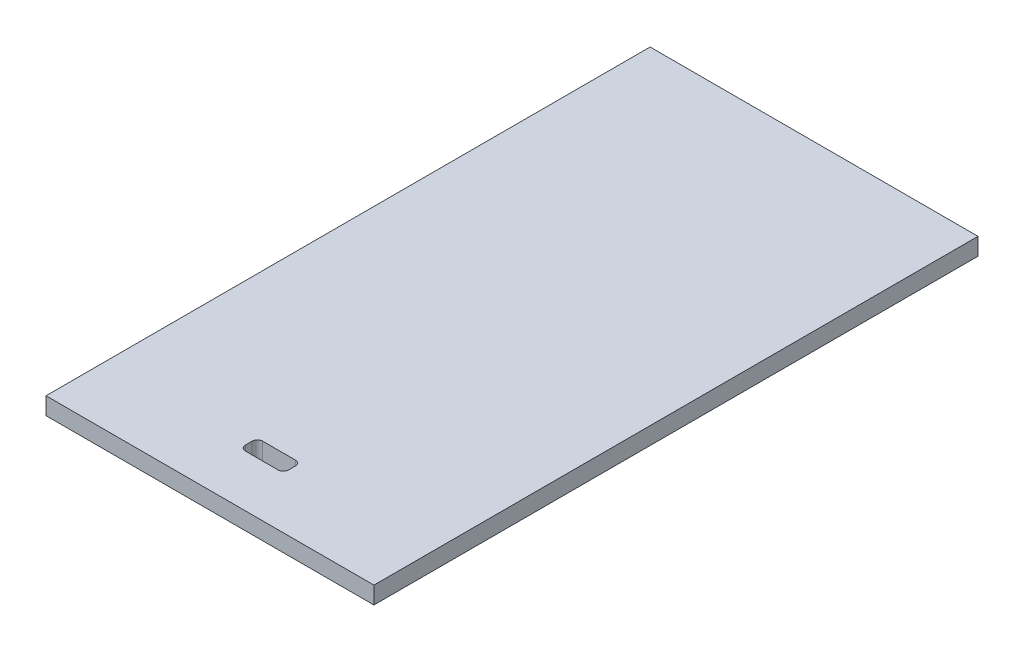
ISO-10303-21;
HEADER;
FILE_DESCRIPTION(('STEP AP214'),'2;1');
FILE_NAME('part.step','',(''),(''),'','','');
FILE_SCHEMA(('AUTOMOTIVE_DESIGN { 1 0 10303 214 1 1 1 1 }'));
ENDSEC;
DATA;
#1=APPLICATION_CONTEXT('core data for automotive mechanical design processes');
#2=APPLICATION_PROTOCOL_DEFINITION('international standard','automotive_design',2000,#1);
#3=PRODUCT_CONTEXT('',#1,'mechanical');
#4=PRODUCT('Part','Part','',(#3));
#5=PRODUCT_RELATED_PRODUCT_CATEGORY('part','',(#4));
#6=PRODUCT_DEFINITION_FORMATION('','',#4);
#7=PRODUCT_DEFINITION_CONTEXT('part definition',#1,'design');
#8=PRODUCT_DEFINITION('design','',#6,#7);
#9=PRODUCT_DEFINITION_SHAPE('','',#8);
#10=(LENGTH_UNIT() NAMED_UNIT(*) SI_UNIT(.MILLI.,.METRE.));
#11=(NAMED_UNIT(*) PLANE_ANGLE_UNIT() SI_UNIT($,.RADIAN.));
#12=(NAMED_UNIT(*) SI_UNIT($,.STERADIAN.) SOLID_ANGLE_UNIT());
#13=UNCERTAINTY_MEASURE_WITH_UNIT(LENGTH_MEASURE(1.E-05),#10,'distance_accuracy_value','');
#14=(GEOMETRIC_REPRESENTATION_CONTEXT(3) GLOBAL_UNCERTAINTY_ASSIGNED_CONTEXT((#13)) GLOBAL_UNIT_ASSIGNED_CONTEXT((#10,
#11,#12)) REPRESENTATION_CONTEXT('',''));
#15=CARTESIAN_POINT('',(0.,0.,0.));
#16=DIRECTION('',(0.,0.,1.));
#17=DIRECTION('',(1.,0.,0.));
#18=AXIS2_PLACEMENT_3D('',#15,#16,#17);
#19=CARTESIAN_POINT('',(0.,20.,0.));
#20=DIRECTION('',(1.,0.,0.));
#21=DIRECTION('',(0.,0.,-1.));
#22=AXIS2_PLACEMENT_3D('',#19,#20,#21);
#23=PLANE('',#22);
#24=DIRECTION('',(0.,0.,1.));
#25=VECTOR('',#24,1.);
#26=CARTESIAN_POINT('',(0.,0.,0.));
#27=LINE('',#26,#25);
#28=CARTESIAN_POINT('',(0.,0.,-700.));
#29=VERTEX_POINT('',#28);
#30=CARTESIAN_POINT('',(0.,0.,0.));
#31=VERTEX_POINT('',#30);
#32=EDGE_CURVE('E200',#29,#31,#27,.T.);
#33=ORIENTED_EDGE('',*,*,#32,.T.);
#34=DIRECTION('',(0.,-1.,0.));
#35=VECTOR('',#34,1.);
#36=CARTESIAN_POINT('',(0.,20.,0.));
#37=LINE('',#36,#35);
#38=CARTESIAN_POINT('',(0.,20.,0.));
#39=VERTEX_POINT('',#38);
#40=EDGE_CURVE('E11',#39,#31,#37,.T.);
#41=ORIENTED_EDGE('',*,*,#40,.F.);
#42=DIRECTION('',(0.,0.,1.));
#43=VECTOR('',#42,1.);
#44=CARTESIAN_POINT('',(0.,20.,0.));
#45=LINE('',#44,#43);
#46=CARTESIAN_POINT('',(0.,20.,-700.));
#47=VERTEX_POINT('',#46);
#48=EDGE_CURVE('E201',#47,#39,#45,.T.);
#49=ORIENTED_EDGE('',*,*,#48,.F.);
#50=DIRECTION('',(0.,-1.,0.));
#51=VECTOR('',#50,1.);
#52=CARTESIAN_POINT('',(0.,20.,-700.));
#53=LINE('',#52,#51);
#54=EDGE_CURVE('E212',#47,#29,#53,.T.);
#55=ORIENTED_EDGE('',*,*,#54,.T.);
#56=EDGE_LOOP('',(#33,#41,#49,#55));
#57=FACE_BOUND('',#56,.T.);
#58=ADVANCED_FACE('F41',(#57),#23,.F.);
#59=CARTESIAN_POINT('',(380.,20.,0.));
#60=DIRECTION('',(0.,0.,-1.));
#61=DIRECTION('',(-1.,0.,0.));
#62=AXIS2_PLACEMENT_3D('',#59,#60,#61);
#63=PLANE('',#62);
#64=DIRECTION('',(1.,0.,0.));
#65=VECTOR('',#64,1.);
#66=CARTESIAN_POINT('',(380.,0.,0.));
#67=LINE('',#66,#65);
#68=CARTESIAN_POINT('',(380.,0.,0.));
#69=VERTEX_POINT('',#68);
#70=EDGE_CURVE('E215',#31,#69,#67,.T.);
#71=ORIENTED_EDGE('',*,*,#70,.T.);
#72=DIRECTION('',(0.,1.,0.));
#73=VECTOR('',#72,1.);
#74=CARTESIAN_POINT('',(380.,0.,0.));
#75=LINE('',#74,#73);
#76=CARTESIAN_POINT('',(380.,20.,0.));
#77=VERTEX_POINT('',#76);
#78=EDGE_CURVE('E186',#69,#77,#75,.T.);
#79=ORIENTED_EDGE('',*,*,#78,.T.);
#80=DIRECTION('',(1.,0.,0.));
#81=VECTOR('',#80,1.);
#82=CARTESIAN_POINT('',(0.,20.,0.));
#83=LINE('',#82,#81);
#84=EDGE_CURVE('E204',#39,#77,#83,.T.);
#85=ORIENTED_EDGE('',*,*,#84,.F.);
#86=ORIENTED_EDGE('',*,*,#40,.T.);
#87=EDGE_LOOP('',(#71,#79,#85,#86));
#88=FACE_BOUND('',#87,.T.);
#89=ADVANCED_FACE('F239',(#88),#63,.F.);
#90=CARTESIAN_POINT('',(380.,20.,-230.));
#91=DIRECTION('',(-1.,0.,0.));
#92=DIRECTION('',(0.,0.,1.));
#93=AXIS2_PLACEMENT_3D('',#90,#91,#92);
#94=PLANE('',#93);
#95=DIRECTION('',(0.,0.,-1.));
#96=VECTOR('',#95,1.);
#97=CARTESIAN_POINT('',(380.,0.,-230.));
#98=LINE('',#97,#96);
#99=CARTESIAN_POINT('',(380.,0.,-700.));
#100=VERTEX_POINT('',#99);
#101=EDGE_CURVE('E218',#69,#100,#98,.T.);
#102=ORIENTED_EDGE('',*,*,#101,.T.);
#103=DIRECTION('',(0.,-1.,0.));
#104=VECTOR('',#103,1.);
#105=CARTESIAN_POINT('',(380.,20.,-700.));
#106=LINE('',#105,#104);
#107=CARTESIAN_POINT('',(380.,20.,-700.));
#108=VERTEX_POINT('',#107);
#109=EDGE_CURVE('E48',#108,#100,#106,.T.);
#110=ORIENTED_EDGE('',*,*,#109,.F.);
#111=DIRECTION('',(0.,0.,-1.));
#112=VECTOR('',#111,1.);
#113=CARTESIAN_POINT('',(380.,20.,-230.));
#114=LINE('',#113,#112);
#115=EDGE_CURVE('E208',#77,#108,#114,.T.);
#116=ORIENTED_EDGE('',*,*,#115,.F.);
#117=ORIENTED_EDGE('',*,*,#78,.F.);
#118=EDGE_LOOP('',(#102,#110,#116,#117));
#119=FACE_BOUND('',#118,.T.);
#120=ADVANCED_FACE('F237',(#119),#94,.F.);
#121=CARTESIAN_POINT('',(0.,20.,-700.));
#122=DIRECTION('',(0.,0.,1.));
#123=DIRECTION('',(1.,0.,0.));
#124=AXIS2_PLACEMENT_3D('',#121,#122,#123);
#125=PLANE('',#124);
#126=DIRECTION('',(-1.,0.,0.));
#127=VECTOR('',#126,1.);
#128=CARTESIAN_POINT('',(0.,0.,-700.));
#129=LINE('',#128,#127);
#130=EDGE_CURVE('E205',#100,#29,#129,.T.);
#131=ORIENTED_EDGE('',*,*,#130,.T.);
#132=ORIENTED_EDGE('',*,*,#54,.F.);
#133=DIRECTION('',(-1.,0.,0.));
#134=VECTOR('',#133,1.);
#135=CARTESIAN_POINT('',(0.,20.,-700.));
#136=LINE('',#135,#134);
#137=EDGE_CURVE('E210',#108,#47,#136,.T.);
#138=ORIENTED_EDGE('',*,*,#137,.F.);
#139=ORIENTED_EDGE('',*,*,#109,.T.);
#140=EDGE_LOOP('',(#131,#132,#138,#139));
#141=FACE_BOUND('',#140,.T.);
#142=ADVANCED_FACE('F227',(#141),#125,.F.);
#143=CARTESIAN_POINT('',(0.,20.,0.));
#144=DIRECTION('',(0.,-1.,0.));
#145=DIRECTION('',(0.,0.,-1.));
#146=AXIS2_PLACEMENT_3D('',#143,#144,#145);
#147=PLANE('',#146);
#148=DIRECTION('',(0.,0.,-1.));
#149=VECTOR('',#148,1.);
#150=CARTESIAN_POINT('',(215.,20.,-74.));
#151=LINE('',#150,#149);
#152=CARTESIAN_POINT('',(215.,20.,-66.));
#153=VERTEX_POINT('',#152);
#154=CARTESIAN_POINT('',(215.,20.,-74.));
#155=VERTEX_POINT('',#154);
#156=EDGE_CURVE('E168',#153,#155,#151,.T.);
#157=ORIENTED_EDGE('',*,*,#156,.F.);
#158=CARTESIAN_POINT('',(209.,20.,-66.));
#159=DIRECTION('',(0.,1.,0.));
#160=DIRECTION('',(0.,0.,1.));
#161=AXIS2_PLACEMENT_3D('',#158,#159,#160);
#162=CIRCLE('',#161,5.99999999999999);
#163=CARTESIAN_POINT('',(209.,20.,-60.));
#164=VERTEX_POINT('',#163);
#165=EDGE_CURVE('E55',#164,#153,#162,.T.);
#166=ORIENTED_EDGE('',*,*,#165,.F.);
#167=DIRECTION('',(1.,0.,0.));
#168=VECTOR('',#167,1.);
#169=CARTESIAN_POINT('',(171.,20.,-60.));
#170=LINE('',#169,#168);
#171=CARTESIAN_POINT('',(171.,20.,-60.));
#172=VERTEX_POINT('',#171);
#173=EDGE_CURVE('E148',#172,#164,#170,.T.);
#174=ORIENTED_EDGE('',*,*,#173,.F.);
#175=CARTESIAN_POINT('',(171.,20.,-66.));
#176=DIRECTION('',(0.,1.,0.));
#177=DIRECTION('',(0.,0.,1.));
#178=AXIS2_PLACEMENT_3D('',#175,#176,#177);
#179=CIRCLE('',#178,6.);
#180=CARTESIAN_POINT('',(165.,20.,-66.));
#181=VERTEX_POINT('',#180);
#182=EDGE_CURVE('E151',#181,#172,#179,.T.);
#183=ORIENTED_EDGE('',*,*,#182,.F.);
#184=DIRECTION('',(0.,0.,1.));
#185=VECTOR('',#184,1.);
#186=CARTESIAN_POINT('',(165.,20.,-74.));
#187=LINE('',#186,#185);
#188=CARTESIAN_POINT('',(165.,20.,-74.));
#189=VERTEX_POINT('',#188);
#190=EDGE_CURVE('E179',#189,#181,#187,.T.);
#191=ORIENTED_EDGE('',*,*,#190,.F.);
#192=CARTESIAN_POINT('',(171.,20.,-74.));
#193=DIRECTION('',(0.,1.,0.));
#194=DIRECTION('',(0.,0.,1.));
#195=AXIS2_PLACEMENT_3D('',#192,#193,#194);
#196=CIRCLE('',#195,6.00000000000001);
#197=CARTESIAN_POINT('',(171.,20.,-80.));
#198=VERTEX_POINT('',#197);
#199=EDGE_CURVE('E176',#198,#189,#196,.T.);
#200=ORIENTED_EDGE('',*,*,#199,.F.);
#201=DIRECTION('',(-1.,0.,0.));
#202=VECTOR('',#201,1.);
#203=CARTESIAN_POINT('',(171.,20.,-80.));
#204=LINE('',#203,#202);
#205=CARTESIAN_POINT('',(209.,20.,-80.));
#206=VERTEX_POINT('',#205);
#207=EDGE_CURVE('E173',#206,#198,#204,.T.);
#208=ORIENTED_EDGE('',*,*,#207,.F.);
#209=CARTESIAN_POINT('',(209.,20.,-74.));
#210=DIRECTION('',(0.,1.,0.));
#211=DIRECTION('',(0.,0.,-1.));
#212=AXIS2_PLACEMENT_3D('',#209,#210,#211);
#213=CIRCLE('',#212,6.00000000000001);
#214=EDGE_CURVE('E170',#155,#206,#213,.T.);
#215=ORIENTED_EDGE('',*,*,#214,.F.);
#216=EDGE_LOOP('',(#157,#166,#174,#183,#191,#200,#208,#215));
#217=FACE_BOUND('',#216,.T.);
#218=ORIENTED_EDGE('',*,*,#84,.T.);
#219=ORIENTED_EDGE('',*,*,#115,.T.);
#220=ORIENTED_EDGE('',*,*,#137,.T.);
#221=ORIENTED_EDGE('',*,*,#48,.T.);
#222=EDGE_LOOP('',(#218,#219,#220,#221));
#223=FACE_BOUND('',#222,.T.);
#224=ADVANCED_FACE('F236',(#217,#223),#147,.F.);
#225=CARTESIAN_POINT('',(0.,0.,0.));
#226=DIRECTION('',(0.,-1.,0.));
#227=DIRECTION('',(0.,0.,-1.));
#228=AXIS2_PLACEMENT_3D('',#225,#226,#227);
#229=PLANE('',#228);
#230=CARTESIAN_POINT('',(209.,0.,-66.));
#231=DIRECTION('',(0.,1.,0.));
#232=DIRECTION('',(0.,0.,1.));
#233=AXIS2_PLACEMENT_3D('',#230,#231,#232);
#234=CIRCLE('',#233,5.99999999999999);
#235=CARTESIAN_POINT('',(209.,0.,-60.));
#236=VERTEX_POINT('',#235);
#237=CARTESIAN_POINT('',(215.,0.,-66.));
#238=VERTEX_POINT('',#237);
#239=EDGE_CURVE('E131',#236,#238,#234,.T.);
#240=ORIENTED_EDGE('',*,*,#239,.T.);
#241=DIRECTION('',(0.,0.,-1.));
#242=VECTOR('',#241,1.);
#243=CARTESIAN_POINT('',(215.,0.,-74.));
#244=LINE('',#243,#242);
#245=CARTESIAN_POINT('',(215.,0.,-74.));
#246=VERTEX_POINT('',#245);
#247=EDGE_CURVE('E140',#238,#246,#244,.T.);
#248=ORIENTED_EDGE('',*,*,#247,.T.);
#249=CARTESIAN_POINT('',(209.,0.,-74.));
#250=DIRECTION('',(0.,1.,0.));
#251=DIRECTION('',(0.,0.,-1.));
#252=AXIS2_PLACEMENT_3D('',#249,#250,#251);
#253=CIRCLE('',#252,6.00000000000001);
#254=CARTESIAN_POINT('',(209.,0.,-80.));
#255=VERTEX_POINT('',#254);
#256=EDGE_CURVE('E63',#246,#255,#253,.T.);
#257=ORIENTED_EDGE('',*,*,#256,.T.);
#258=DIRECTION('',(-1.,0.,0.));
#259=VECTOR('',#258,1.);
#260=CARTESIAN_POINT('',(171.,0.,-80.));
#261=LINE('',#260,#259);
#262=CARTESIAN_POINT('',(171.,0.,-80.));
#263=VERTEX_POINT('',#262);
#264=EDGE_CURVE('E155',#255,#263,#261,.T.);
#265=ORIENTED_EDGE('',*,*,#264,.T.);
#266=CARTESIAN_POINT('',(171.,0.,-74.));
#267=DIRECTION('',(0.,1.,0.));
#268=DIRECTION('',(0.,0.,1.));
#269=AXIS2_PLACEMENT_3D('',#266,#267,#268);
#270=CIRCLE('',#269,6.00000000000001);
#271=CARTESIAN_POINT('',(165.,0.,-74.));
#272=VERTEX_POINT('',#271);
#273=EDGE_CURVE('E158',#263,#272,#270,.T.);
#274=ORIENTED_EDGE('',*,*,#273,.T.);
#275=DIRECTION('',(0.,0.,1.));
#276=VECTOR('',#275,1.);
#277=CARTESIAN_POINT('',(165.,0.,-74.));
#278=LINE('',#277,#276);
#279=CARTESIAN_POINT('',(165.,0.,-66.));
#280=VERTEX_POINT('',#279);
#281=EDGE_CURVE('E161',#272,#280,#278,.T.);
#282=ORIENTED_EDGE('',*,*,#281,.T.);
#283=CARTESIAN_POINT('',(171.,0.,-66.));
#284=DIRECTION('',(0.,1.,0.));
#285=DIRECTION('',(0.,0.,1.));
#286=AXIS2_PLACEMENT_3D('',#283,#284,#285);
#287=CIRCLE('',#286,6.);
#288=CARTESIAN_POINT('',(171.,0.,-60.));
#289=VERTEX_POINT('',#288);
#290=EDGE_CURVE('E164',#280,#289,#287,.T.);
#291=ORIENTED_EDGE('',*,*,#290,.T.);
#292=DIRECTION('',(1.,0.,0.));
#293=VECTOR('',#292,1.);
#294=CARTESIAN_POINT('',(171.,0.,-60.));
#295=LINE('',#294,#293);
#296=EDGE_CURVE('E137',#289,#236,#295,.T.);
#297=ORIENTED_EDGE('',*,*,#296,.T.);
#298=EDGE_LOOP('',(#240,#248,#257,#265,#274,#282,#291,#297));
#299=FACE_BOUND('',#298,.T.);
#300=ORIENTED_EDGE('',*,*,#101,.F.);
#301=ORIENTED_EDGE('',*,*,#70,.F.);
#302=ORIENTED_EDGE('',*,*,#32,.F.);
#303=ORIENTED_EDGE('',*,*,#130,.F.);
#304=EDGE_LOOP('',(#300,#301,#302,#303));
#305=FACE_BOUND('',#304,.T.);
#306=ADVANCED_FACE('F144',(#299,#305),#229,.T.);
#307=CARTESIAN_POINT('',(209.,0.,-66.));
#308=DIRECTION('',(0.,1.,0.));
#309=DIRECTION('',(0.,0.,1.));
#310=AXIS2_PLACEMENT_3D('',#307,#308,#309);
#311=CYLINDRICAL_SURFACE('',#310,5.99999999999999);
#312=ORIENTED_EDGE('',*,*,#165,.T.);
#313=DIRECTION('',(0.,1.,0.));
#314=VECTOR('',#313,1.);
#315=CARTESIAN_POINT('',(215.,0.,-66.));
#316=LINE('',#315,#314);
#317=EDGE_CURVE('E127',#238,#153,#316,.T.);
#318=ORIENTED_EDGE('',*,*,#317,.F.);
#319=ORIENTED_EDGE('',*,*,#239,.F.);
#320=DIRECTION('',(0.,1.,0.));
#321=VECTOR('',#320,1.);
#322=CARTESIAN_POINT('',(209.,0.,-60.));
#323=LINE('',#322,#321);
#324=EDGE_CURVE('E184',#236,#164,#323,.T.);
#325=ORIENTED_EDGE('',*,*,#324,.T.);
#326=EDGE_LOOP('',(#312,#318,#319,#325));
#327=FACE_BOUND('',#326,.T.);
#328=ADVANCED_FACE('F129',(#327),#311,.F.);
#329=CARTESIAN_POINT('',(171.,0.,-60.));
#330=DIRECTION('',(0.,0.,1.));
#331=DIRECTION('',(1.,0.,0.));
#332=AXIS2_PLACEMENT_3D('',#329,#330,#331);
#333=PLANE('',#332);
#334=ORIENTED_EDGE('',*,*,#173,.T.);
#335=ORIENTED_EDGE('',*,*,#324,.F.);
#336=ORIENTED_EDGE('',*,*,#296,.F.);
#337=DIRECTION('',(0.,1.,0.));
#338=VECTOR('',#337,1.);
#339=CARTESIAN_POINT('',(171.,0.,-60.));
#340=LINE('',#339,#338);
#341=EDGE_CURVE('E187',#289,#172,#340,.T.);
#342=ORIENTED_EDGE('',*,*,#341,.T.);
#343=EDGE_LOOP('',(#334,#335,#336,#342));
#344=FACE_BOUND('',#343,.T.);
#345=ADVANCED_FACE('F256',(#344),#333,.F.);
#346=CARTESIAN_POINT('',(171.,0.,-66.));
#347=DIRECTION('',(0.,1.,0.));
#348=DIRECTION('',(0.,0.,1.));
#349=AXIS2_PLACEMENT_3D('',#346,#347,#348);
#350=CYLINDRICAL_SURFACE('',#349,6.);
#351=ORIENTED_EDGE('',*,*,#182,.T.);
#352=ORIENTED_EDGE('',*,*,#341,.F.);
#353=ORIENTED_EDGE('',*,*,#290,.F.);
#354=DIRECTION('',(0.,1.,0.));
#355=VECTOR('',#354,1.);
#356=CARTESIAN_POINT('',(165.,0.,-66.));
#357=LINE('',#356,#355);
#358=EDGE_CURVE('E189',#280,#181,#357,.T.);
#359=ORIENTED_EDGE('',*,*,#358,.T.);
#360=EDGE_LOOP('',(#351,#352,#353,#359));
#361=FACE_BOUND('',#360,.T.);
#362=ADVANCED_FACE('F273',(#361),#350,.F.);
#363=CARTESIAN_POINT('',(165.,0.,-74.));
#364=DIRECTION('',(-1.,0.,0.));
#365=DIRECTION('',(0.,0.,1.));
#366=AXIS2_PLACEMENT_3D('',#363,#364,#365);
#367=PLANE('',#366);
#368=ORIENTED_EDGE('',*,*,#190,.T.);
#369=ORIENTED_EDGE('',*,*,#358,.F.);
#370=ORIENTED_EDGE('',*,*,#281,.F.);
#371=DIRECTION('',(0.,1.,0.));
#372=VECTOR('',#371,1.);
#373=CARTESIAN_POINT('',(165.,0.,-74.));
#374=LINE('',#373,#372);
#375=EDGE_CURVE('E191',#272,#189,#374,.T.);
#376=ORIENTED_EDGE('',*,*,#375,.T.);
#377=EDGE_LOOP('',(#368,#369,#370,#376));
#378=FACE_BOUND('',#377,.T.);
#379=ADVANCED_FACE('F269',(#378),#367,.F.);
#380=CARTESIAN_POINT('',(171.,0.,-74.));
#381=DIRECTION('',(0.,1.,0.));
#382=DIRECTION('',(0.,0.,1.));
#383=AXIS2_PLACEMENT_3D('',#380,#381,#382);
#384=CYLINDRICAL_SURFACE('',#383,6.00000000000001);
#385=ORIENTED_EDGE('',*,*,#199,.T.);
#386=ORIENTED_EDGE('',*,*,#375,.F.);
#387=ORIENTED_EDGE('',*,*,#273,.F.);
#388=DIRECTION('',(0.,1.,0.));
#389=VECTOR('',#388,1.);
#390=CARTESIAN_POINT('',(171.,0.,-80.));
#391=LINE('',#390,#389);
#392=EDGE_CURVE('E193',#263,#198,#391,.T.);
#393=ORIENTED_EDGE('',*,*,#392,.T.);
#394=EDGE_LOOP('',(#385,#386,#387,#393));
#395=FACE_BOUND('',#394,.T.);
#396=ADVANCED_FACE('F265',(#395),#384,.F.);
#397=CARTESIAN_POINT('',(171.,0.,-80.));
#398=DIRECTION('',(0.,0.,-1.));
#399=DIRECTION('',(-1.,0.,0.));
#400=AXIS2_PLACEMENT_3D('',#397,#398,#399);
#401=PLANE('',#400);
#402=ORIENTED_EDGE('',*,*,#207,.T.);
#403=ORIENTED_EDGE('',*,*,#392,.F.);
#404=ORIENTED_EDGE('',*,*,#264,.F.);
#405=DIRECTION('',(0.,1.,0.));
#406=VECTOR('',#405,1.);
#407=CARTESIAN_POINT('',(209.,0.,-80.));
#408=LINE('',#407,#406);
#409=EDGE_CURVE('E195',#255,#206,#408,.T.);
#410=ORIENTED_EDGE('',*,*,#409,.T.);
#411=EDGE_LOOP('',(#402,#403,#404,#410));
#412=FACE_BOUND('',#411,.T.);
#413=ADVANCED_FACE('F262',(#412),#401,.F.);
#414=CARTESIAN_POINT('',(209.,0.,-74.));
#415=DIRECTION('',(0.,1.,0.));
#416=DIRECTION('',(0.,0.,1.));
#417=AXIS2_PLACEMENT_3D('',#414,#415,#416);
#418=CYLINDRICAL_SURFACE('',#417,6.00000000000001);
#419=ORIENTED_EDGE('',*,*,#214,.T.);
#420=ORIENTED_EDGE('',*,*,#409,.F.);
#421=ORIENTED_EDGE('',*,*,#256,.F.);
#422=DIRECTION('',(0.,1.,0.));
#423=VECTOR('',#422,1.);
#424=CARTESIAN_POINT('',(215.,0.,-74.));
#425=LINE('',#424,#423);
#426=EDGE_CURVE('E136',#246,#155,#425,.T.);
#427=ORIENTED_EDGE('',*,*,#426,.T.);
#428=EDGE_LOOP('',(#419,#420,#421,#427));
#429=FACE_BOUND('',#428,.T.);
#430=ADVANCED_FACE('F259',(#429),#418,.F.);
#431=CARTESIAN_POINT('',(215.,0.,-74.));
#432=DIRECTION('',(1.,0.,0.));
#433=DIRECTION('',(0.,0.,-1.));
#434=AXIS2_PLACEMENT_3D('',#431,#432,#433);
#435=PLANE('',#434);
#436=ORIENTED_EDGE('',*,*,#156,.T.);
#437=ORIENTED_EDGE('',*,*,#426,.F.);
#438=ORIENTED_EDGE('',*,*,#247,.F.);
#439=ORIENTED_EDGE('',*,*,#317,.T.);
#440=EDGE_LOOP('',(#436,#437,#438,#439));
#441=FACE_BOUND('',#440,.T.);
#442=ADVANCED_FACE('F141',(#441),#435,.F.);
#443=CLOSED_SHELL('',(#58,#89,#120,#142,#224,#306,#328,#345,#362,#379,#396,#413,#430,#442));
#444=MANIFOLD_SOLID_BREP('B2',#443);
#445=ADVANCED_BREP_SHAPE_REPRESENTATION('',(#18,#444),#14);
#446=SHAPE_DEFINITION_REPRESENTATION(#9,#445);
ENDSEC;
END-ISO-10303-21;
